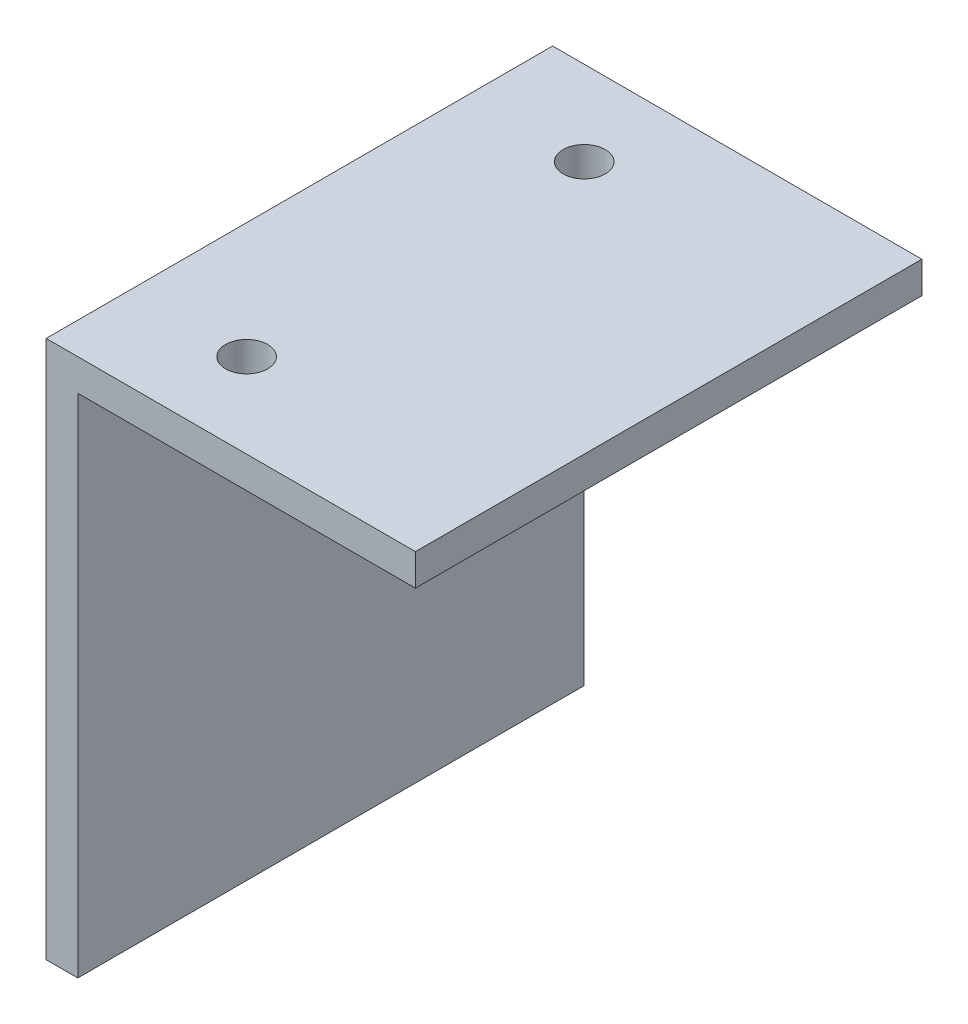
ISO-10303-21;
HEADER;
FILE_DESCRIPTION(('STEP AP214'),'2;1');
FILE_NAME('part.step','',(''),(''),'','','');
FILE_SCHEMA(('AUTOMOTIVE_DESIGN { 1 0 10303 214 1 1 1 1 }'));
ENDSEC;
DATA;
#1=APPLICATION_CONTEXT('core data for automotive mechanical design processes');
#2=APPLICATION_PROTOCOL_DEFINITION('international standard','automotive_design',2000,#1);
#3=PRODUCT_CONTEXT('',#1,'mechanical');
#4=PRODUCT('Part','Part','',(#3));
#5=PRODUCT_RELATED_PRODUCT_CATEGORY('part','',(#4));
#6=PRODUCT_DEFINITION_FORMATION('','',#4);
#7=PRODUCT_DEFINITION_CONTEXT('part definition',#1,'design');
#8=PRODUCT_DEFINITION('design','',#6,#7);
#9=PRODUCT_DEFINITION_SHAPE('','',#8);
#10=(LENGTH_UNIT() NAMED_UNIT(*) SI_UNIT(.MILLI.,.METRE.));
#11=(NAMED_UNIT(*) PLANE_ANGLE_UNIT() SI_UNIT($,.RADIAN.));
#12=(NAMED_UNIT(*) SI_UNIT($,.STERADIAN.) SOLID_ANGLE_UNIT());
#13=UNCERTAINTY_MEASURE_WITH_UNIT(LENGTH_MEASURE(1.E-05),#10,'distance_accuracy_value','');
#14=(GEOMETRIC_REPRESENTATION_CONTEXT(3) GLOBAL_UNCERTAINTY_ASSIGNED_CONTEXT((#13)) GLOBAL_UNIT_ASSIGNED_CONTEXT((#10,
#11,#12)) REPRESENTATION_CONTEXT('',''));
#15=CARTESIAN_POINT('',(0.,0.,0.));
#16=DIRECTION('',(0.,0.,1.));
#17=DIRECTION('',(1.,0.,0.));
#18=AXIS2_PLACEMENT_3D('',#15,#16,#17);
#19=CARTESIAN_POINT('',(0.,0.,0.));
#20=DIRECTION('',(0.,1.,0.));
#21=DIRECTION('',(0.,0.,1.));
#22=AXIS2_PLACEMENT_3D('',#19,#20,#21);
#23=PLANE('',#22);
#24=CARTESIAN_POINT('',(-6.50000000000001,0.,16.));
#25=DIRECTION('',(0.,1.,0.));
#26=DIRECTION('',(0.,0.,-1.));
#27=AXIS2_PLACEMENT_3D('',#24,#25,#26);
#28=CIRCLE('',#27,2.);
#29=CARTESIAN_POINT('',(-6.50000000000001,0.,14.));
#30=VERTEX_POINT('',#29);
#31=EDGE_CURVE('E123',#30,#30,#28,.T.);
#32=ORIENTED_EDGE('',*,*,#31,.T.);
#33=EDGE_LOOP('',(#32));
#34=FACE_BOUND('',#33,.T.);
#35=CARTESIAN_POINT('',(-6.50000000000001,0.,-16.));
#36=DIRECTION('',(0.,1.,0.));
#37=DIRECTION('',(0.,0.,1.));
#38=AXIS2_PLACEMENT_3D('',#35,#36,#37);
#39=CIRCLE('',#38,2.);
#40=CARTESIAN_POINT('',(-6.50000000000001,0.,-14.));
#41=VERTEX_POINT('',#40);
#42=EDGE_CURVE('E127',#41,#41,#39,.T.);
#43=ORIENTED_EDGE('',*,*,#42,.T.);
#44=EDGE_LOOP('',(#43));
#45=FACE_BOUND('',#44,.T.);
#46=DIRECTION('',(0.,0.,1.));
#47=VECTOR('',#46,1.);
#48=CARTESIAN_POINT('',(-14.5,0.,24.));
#49=LINE('',#48,#47);
#50=CARTESIAN_POINT('',(-14.5,0.,-24.));
#51=VERTEX_POINT('',#50);
#52=CARTESIAN_POINT('',(-14.5,0.,24.));
#53=VERTEX_POINT('',#52);
#54=EDGE_CURVE('E48',#51,#53,#49,.T.);
#55=ORIENTED_EDGE('',*,*,#54,.F.);
#56=DIRECTION('',(-1.,0.,0.));
#57=VECTOR('',#56,1.);
#58=CARTESIAN_POINT('',(17.5,0.,-24.));
#59=LINE('',#58,#57);
#60=CARTESIAN_POINT('',(17.5,0.,-24.));
#61=VERTEX_POINT('',#60);
#62=EDGE_CURVE('E138',#61,#51,#59,.T.);
#63=ORIENTED_EDGE('',*,*,#62,.F.);
#64=DIRECTION('',(0.,0.,-1.));
#65=VECTOR('',#64,1.);
#66=CARTESIAN_POINT('',(17.5,0.,24.));
#67=LINE('',#66,#65);
#68=CARTESIAN_POINT('',(17.5,0.,24.));
#69=VERTEX_POINT('',#68);
#70=EDGE_CURVE('E73',#69,#61,#67,.T.);
#71=ORIENTED_EDGE('',*,*,#70,.F.);
#72=DIRECTION('',(1.,0.,0.));
#73=VECTOR('',#72,1.);
#74=CARTESIAN_POINT('',(17.5,0.,24.));
#75=LINE('',#74,#73);
#76=EDGE_CURVE('E133',#53,#69,#75,.T.);
#77=ORIENTED_EDGE('',*,*,#76,.F.);
#78=EDGE_LOOP('',(#55,#63,#71,#77));
#79=FACE_BOUND('',#78,.T.);
#80=ADVANCED_FACE('F33',(#34,#45,#79),#23,.F.);
#81=CARTESIAN_POINT('',(0.,3.,0.));
#82=DIRECTION('',(0.,1.,0.));
#83=DIRECTION('',(0.,0.,1.));
#84=AXIS2_PLACEMENT_3D('',#81,#82,#83);
#85=PLANE('',#84);
#86=CARTESIAN_POINT('',(-6.50000000000001,3.,-16.));
#87=DIRECTION('',(0.,1.,0.));
#88=DIRECTION('',(0.,0.,1.));
#89=AXIS2_PLACEMENT_3D('',#86,#87,#88);
#90=CIRCLE('',#89,2.);
#91=CARTESIAN_POINT('',(-6.50000000000001,3.,-14.));
#92=VERTEX_POINT('',#91);
#93=EDGE_CURVE('E130',#92,#92,#90,.T.);
#94=ORIENTED_EDGE('',*,*,#93,.F.);
#95=EDGE_LOOP('',(#94));
#96=FACE_BOUND('',#95,.T.);
#97=DIRECTION('',(0.,0.,1.));
#98=VECTOR('',#97,1.);
#99=CARTESIAN_POINT('',(-17.5,3.,24.));
#100=LINE('',#99,#98);
#101=CARTESIAN_POINT('',(-17.5,3.,-24.));
#102=VERTEX_POINT('',#101);
#103=CARTESIAN_POINT('',(-17.5,3.,24.));
#104=VERTEX_POINT('',#103);
#105=EDGE_CURVE('E136',#102,#104,#100,.T.);
#106=ORIENTED_EDGE('',*,*,#105,.T.);
#107=DIRECTION('',(1.,0.,0.));
#108=VECTOR('',#107,1.);
#109=CARTESIAN_POINT('',(17.5,3.,24.));
#110=LINE('',#109,#108);
#111=CARTESIAN_POINT('',(17.5,3.,24.));
#112=VERTEX_POINT('',#111);
#113=EDGE_CURVE('E80',#104,#112,#110,.T.);
#114=ORIENTED_EDGE('',*,*,#113,.T.);
#115=DIRECTION('',(0.,0.,-1.));
#116=VECTOR('',#115,1.);
#117=CARTESIAN_POINT('',(17.5,3.,24.));
#118=LINE('',#117,#116);
#119=CARTESIAN_POINT('',(17.5,3.,-24.));
#120=VERTEX_POINT('',#119);
#121=EDGE_CURVE('E140',#112,#120,#118,.T.);
#122=ORIENTED_EDGE('',*,*,#121,.T.);
#123=DIRECTION('',(-1.,0.,0.));
#124=VECTOR('',#123,1.);
#125=CARTESIAN_POINT('',(17.5,3.,-24.));
#126=LINE('',#125,#124);
#127=EDGE_CURVE('E57',#120,#102,#126,.T.);
#128=ORIENTED_EDGE('',*,*,#127,.T.);
#129=EDGE_LOOP('',(#106,#114,#122,#128));
#130=FACE_BOUND('',#129,.T.);
#131=CARTESIAN_POINT('',(-6.50000000000001,3.,16.));
#132=DIRECTION('',(0.,1.,0.));
#133=DIRECTION('',(0.,0.,-1.));
#134=AXIS2_PLACEMENT_3D('',#131,#132,#133);
#135=CIRCLE('',#134,2.);
#136=CARTESIAN_POINT('',(-6.50000000000001,3.,14.));
#137=VERTEX_POINT('',#136);
#138=EDGE_CURVE('E124',#137,#137,#135,.T.);
#139=ORIENTED_EDGE('',*,*,#138,.F.);
#140=EDGE_LOOP('',(#139));
#141=FACE_BOUND('',#140,.T.);
#142=ADVANCED_FACE('F167',(#96,#130,#141),#85,.T.);
#143=CARTESIAN_POINT('',(-17.5,3.,24.));
#144=DIRECTION('',(1.,0.,0.));
#145=DIRECTION('',(0.,0.,-1.));
#146=AXIS2_PLACEMENT_3D('',#143,#144,#145);
#147=PLANE('',#146);
#148=DIRECTION('',(0.,-1.,0.));
#149=VECTOR('',#148,1.);
#150=CARTESIAN_POINT('',(-17.5,3.,-24.));
#151=LINE('',#150,#149);
#152=CARTESIAN_POINT('',(-17.5,-48.,-24.));
#153=VERTEX_POINT('',#152);
#154=EDGE_CURVE('E104',#102,#153,#151,.T.);
#155=ORIENTED_EDGE('',*,*,#154,.T.);
#156=DIRECTION('',(0.,0.,-1.));
#157=VECTOR('',#156,1.);
#158=CARTESIAN_POINT('',(-17.5,-48.,24.));
#159=LINE('',#158,#157);
#160=CARTESIAN_POINT('',(-17.5,-48.,24.));
#161=VERTEX_POINT('',#160);
#162=EDGE_CURVE('E103',#161,#153,#159,.T.);
#163=ORIENTED_EDGE('',*,*,#162,.F.);
#164=DIRECTION('',(0.,-1.,0.));
#165=VECTOR('',#164,1.);
#166=CARTESIAN_POINT('',(-17.5,3.,24.));
#167=LINE('',#166,#165);
#168=EDGE_CURVE('E11',#104,#161,#167,.T.);
#169=ORIENTED_EDGE('',*,*,#168,.F.);
#170=ORIENTED_EDGE('',*,*,#105,.F.);
#171=EDGE_LOOP('',(#155,#163,#169,#170));
#172=FACE_BOUND('',#171,.T.);
#173=ADVANCED_FACE('F35',(#172),#147,.F.);
#174=CARTESIAN_POINT('',(17.5,3.,24.));
#175=DIRECTION('',(0.,0.,-1.));
#176=DIRECTION('',(-1.,0.,0.));
#177=AXIS2_PLACEMENT_3D('',#174,#175,#176);
#178=PLANE('',#177);
#179=ORIENTED_EDGE('',*,*,#168,.T.);
#180=DIRECTION('',(-1.,0.,0.));
#181=VECTOR('',#180,1.);
#182=CARTESIAN_POINT('',(-17.5,-48.,24.));
#183=LINE('',#182,#181);
#184=CARTESIAN_POINT('',(-14.5,-48.,24.));
#185=VERTEX_POINT('',#184);
#186=EDGE_CURVE('E99',#185,#161,#183,.T.);
#187=ORIENTED_EDGE('',*,*,#186,.F.);
#188=DIRECTION('',(0.,1.,0.));
#189=VECTOR('',#188,1.);
#190=CARTESIAN_POINT('',(-14.5,-48.,24.));
#191=LINE('',#190,#189);
#192=EDGE_CURVE('E117',#185,#53,#191,.T.);
#193=ORIENTED_EDGE('',*,*,#192,.T.);
#194=ORIENTED_EDGE('',*,*,#76,.T.);
#195=DIRECTION('',(0.,-1.,0.));
#196=VECTOR('',#195,1.);
#197=CARTESIAN_POINT('',(17.5,3.,24.));
#198=LINE('',#197,#196);
#199=EDGE_CURVE('E41',#112,#69,#198,.T.);
#200=ORIENTED_EDGE('',*,*,#199,.F.);
#201=ORIENTED_EDGE('',*,*,#113,.F.);
#202=EDGE_LOOP('',(#179,#187,#193,#194,#200,#201));
#203=FACE_BOUND('',#202,.T.);
#204=ADVANCED_FACE('F96',(#203),#178,.F.);
#205=CARTESIAN_POINT('',(17.5,3.,24.));
#206=DIRECTION('',(-1.,0.,0.));
#207=DIRECTION('',(0.,0.,1.));
#208=AXIS2_PLACEMENT_3D('',#205,#206,#207);
#209=PLANE('',#208);
#210=ORIENTED_EDGE('',*,*,#70,.T.);
#211=DIRECTION('',(0.,-1.,0.));
#212=VECTOR('',#211,1.);
#213=CARTESIAN_POINT('',(17.5,3.,-24.));
#214=LINE('',#213,#212);
#215=EDGE_CURVE('E147',#120,#61,#214,.T.);
#216=ORIENTED_EDGE('',*,*,#215,.F.);
#217=ORIENTED_EDGE('',*,*,#121,.F.);
#218=ORIENTED_EDGE('',*,*,#199,.T.);
#219=EDGE_LOOP('',(#210,#216,#217,#218));
#220=FACE_BOUND('',#219,.T.);
#221=ADVANCED_FACE('F149',(#220),#209,.F.);
#222=CARTESIAN_POINT('',(17.5,3.,-24.));
#223=DIRECTION('',(0.,0.,1.));
#224=DIRECTION('',(1.,0.,0.));
#225=AXIS2_PLACEMENT_3D('',#222,#223,#224);
#226=PLANE('',#225);
#227=ORIENTED_EDGE('',*,*,#62,.T.);
#228=DIRECTION('',(0.,1.,0.));
#229=VECTOR('',#228,1.);
#230=CARTESIAN_POINT('',(-14.5,-48.,-24.));
#231=LINE('',#230,#229);
#232=CARTESIAN_POINT('',(-14.5,-48.,-24.));
#233=VERTEX_POINT('',#232);
#234=EDGE_CURVE('E120',#233,#51,#231,.T.);
#235=ORIENTED_EDGE('',*,*,#234,.F.);
#236=DIRECTION('',(1.,0.,0.));
#237=VECTOR('',#236,1.);
#238=CARTESIAN_POINT('',(-17.5,-48.,-24.));
#239=LINE('',#238,#237);
#240=EDGE_CURVE('E107',#153,#233,#239,.T.);
#241=ORIENTED_EDGE('',*,*,#240,.F.);
#242=ORIENTED_EDGE('',*,*,#154,.F.);
#243=ORIENTED_EDGE('',*,*,#127,.F.);
#244=ORIENTED_EDGE('',*,*,#215,.T.);
#245=EDGE_LOOP('',(#227,#235,#241,#242,#243,#244));
#246=FACE_BOUND('',#245,.T.);
#247=ADVANCED_FACE('F152',(#246),#226,.F.);
#248=CARTESIAN_POINT('',(-6.50000000000001,3.,-16.));
#249=DIRECTION('',(0.,-1.,0.));
#250=DIRECTION('',(0.,0.,-1.));
#251=AXIS2_PLACEMENT_3D('',#248,#249,#250);
#252=CYLINDRICAL_SURFACE('',#251,2.);
#253=ORIENTED_EDGE('',*,*,#93,.T.);
#254=EDGE_LOOP('',(#253));
#255=FACE_BOUND('',#254,.T.);
#256=ORIENTED_EDGE('',*,*,#42,.F.);
#257=EDGE_LOOP('',(#256));
#258=FACE_BOUND('',#257,.T.);
#259=ADVANCED_FACE('F163',(#255,#258),#252,.F.);
#260=CARTESIAN_POINT('',(-6.50000000000001,3.,16.));
#261=DIRECTION('',(0.,-1.,0.));
#262=DIRECTION('',(0.,0.,-1.));
#263=AXIS2_PLACEMENT_3D('',#260,#261,#262);
#264=CYLINDRICAL_SURFACE('',#263,2.);
#265=ORIENTED_EDGE('',*,*,#138,.T.);
#266=EDGE_LOOP('',(#265));
#267=FACE_BOUND('',#266,.T.);
#268=ORIENTED_EDGE('',*,*,#31,.F.);
#269=EDGE_LOOP('',(#268));
#270=FACE_BOUND('',#269,.T.);
#271=ADVANCED_FACE('F156',(#267,#270),#264,.F.);
#272=CARTESIAN_POINT('',(-14.5,-48.,24.));
#273=DIRECTION('',(-1.,0.,0.));
#274=DIRECTION('',(0.,0.,1.));
#275=AXIS2_PLACEMENT_3D('',#272,#273,#274);
#276=PLANE('',#275);
#277=ORIENTED_EDGE('',*,*,#54,.T.);
#278=ORIENTED_EDGE('',*,*,#192,.F.);
#279=DIRECTION('',(0.,0.,1.));
#280=VECTOR('',#279,1.);
#281=CARTESIAN_POINT('',(-14.5,-48.,24.));
#282=LINE('',#281,#280);
#283=EDGE_CURVE('E111',#233,#185,#282,.T.);
#284=ORIENTED_EDGE('',*,*,#283,.F.);
#285=ORIENTED_EDGE('',*,*,#234,.T.);
#286=EDGE_LOOP('',(#277,#278,#284,#285));
#287=FACE_BOUND('',#286,.T.);
#288=ADVANCED_FACE('F154',(#287),#276,.F.);
#289=CARTESIAN_POINT('',(0.,-48.,0.));
#290=DIRECTION('',(0.,1.,0.));
#291=DIRECTION('',(0.,0.,1.));
#292=AXIS2_PLACEMENT_3D('',#289,#290,#291);
#293=PLANE('',#292);
#294=ORIENTED_EDGE('',*,*,#186,.T.);
#295=ORIENTED_EDGE('',*,*,#162,.T.);
#296=ORIENTED_EDGE('',*,*,#240,.T.);
#297=ORIENTED_EDGE('',*,*,#283,.T.);
#298=EDGE_LOOP('',(#294,#295,#296,#297));
#299=FACE_BOUND('',#298,.T.);
#300=ADVANCED_FACE('F109',(#299),#293,.F.);
#301=CLOSED_SHELL('',(#80,#142,#173,#204,#221,#247,#259,#271,#288,#300));
#302=MANIFOLD_SOLID_BREP('B2',#301);
#303=ADVANCED_BREP_SHAPE_REPRESENTATION('',(#18,#302),#14);
#304=SHAPE_DEFINITION_REPRESENTATION(#9,#303);
ENDSEC;
END-ISO-10303-21;
